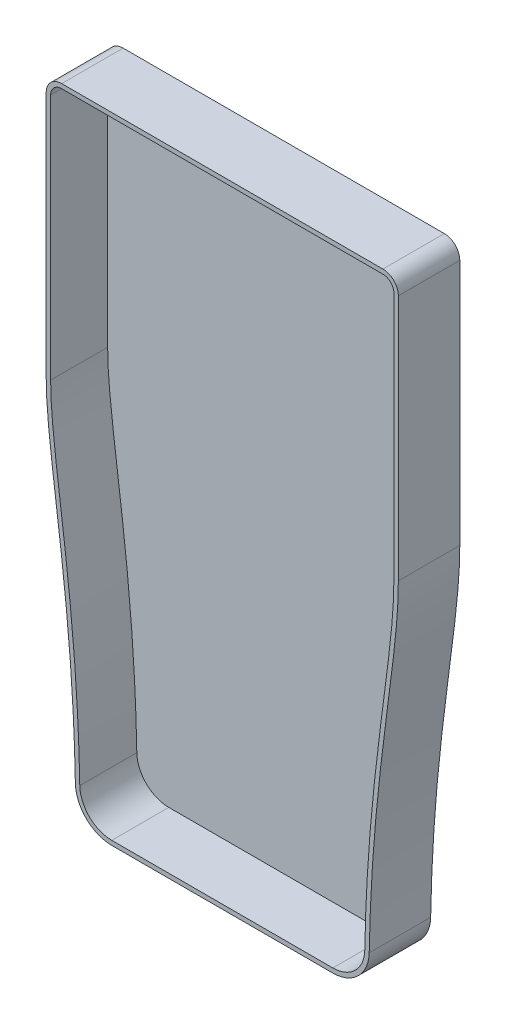
ISO-10303-21;
HEADER;
FILE_DESCRIPTION(('STEP AP214'),'2;1');
FILE_NAME('part.step','',(''),(''),'','','');
FILE_SCHEMA(('AUTOMOTIVE_DESIGN { 1 0 10303 214 1 1 1 1 }'));
ENDSEC;
DATA;
#1=APPLICATION_CONTEXT('core data for automotive mechanical design processes');
#2=APPLICATION_PROTOCOL_DEFINITION('international standard','automotive_design',2000,#1);
#3=PRODUCT_CONTEXT('',#1,'mechanical');
#4=PRODUCT('Part','Part','',(#3));
#5=PRODUCT_RELATED_PRODUCT_CATEGORY('part','',(#4));
#6=PRODUCT_DEFINITION_FORMATION('','',#4);
#7=PRODUCT_DEFINITION_CONTEXT('part definition',#1,'design');
#8=PRODUCT_DEFINITION('design','',#6,#7);
#9=PRODUCT_DEFINITION_SHAPE('','',#8);
#10=(LENGTH_UNIT() NAMED_UNIT(*) SI_UNIT(.MILLI.,.METRE.));
#11=(NAMED_UNIT(*) PLANE_ANGLE_UNIT() SI_UNIT($,.RADIAN.));
#12=(NAMED_UNIT(*) SI_UNIT($,.STERADIAN.) SOLID_ANGLE_UNIT());
#13=UNCERTAINTY_MEASURE_WITH_UNIT(LENGTH_MEASURE(1.E-05),#10,'distance_accuracy_value','');
#14=(GEOMETRIC_REPRESENTATION_CONTEXT(3) GLOBAL_UNCERTAINTY_ASSIGNED_CONTEXT((#13)) GLOBAL_UNIT_ASSIGNED_CONTEXT((#10,
#11,#12)) REPRESENTATION_CONTEXT('',''));
#15=CARTESIAN_POINT('',(0.,0.,0.));
#16=DIRECTION('',(0.,0.,1.));
#17=DIRECTION('',(1.,0.,0.));
#18=AXIS2_PLACEMENT_3D('',#15,#16,#17);
#19=CARTESIAN_POINT('',(105.710048323097,-5.29325956231415,15.5));
#20=DIRECTION('',(0.,0.,-1.));
#21=DIRECTION('',(-1.,0.,0.));
#22=AXIS2_PLACEMENT_3D('',#19,#20,#21);
#23=PLANE('',#22);
#24=DIRECTION('',(0.,1.,0.));
#25=VECTOR('',#24,1.);
#26=CARTESIAN_POINT('',(196.210048323097,-5.29325956231415,15.5));
#27=LINE('',#26,#25);
#28=CARTESIAN_POINT('',(196.210048323097,33.070955585428,15.5));
#29=VERTEX_POINT('',#28);
#30=CARTESIAN_POINT('',(196.210048323097,100.170955585428,15.5));
#31=VERTEX_POINT('',#30);
#32=EDGE_CURVE('E178',#29,#31,#27,.T.);
#33=ORIENTED_EDGE('',*,*,#32,.T.);
#34=CARTESIAN_POINT('',(192.010048323097,100.170955585428,15.5));
#35=DIRECTION('',(0.,0.,-1.));
#36=DIRECTION('',(-1.,0.,0.));
#37=AXIS2_PLACEMENT_3D('',#34,#35,#36);
#38=CIRCLE('',#37,4.2);
#39=CARTESIAN_POINT('',(192.010048323097,104.370955585428,15.5));
#40=VERTEX_POINT('',#39);
#41=EDGE_CURVE('E42',#31,#40,#38,.F.);
#42=ORIENTED_EDGE('',*,*,#41,.T.);
#43=DIRECTION('',(1.,0.,0.));
#44=VECTOR('',#43,1.);
#45=CARTESIAN_POINT('',(105.710048323097,104.370955585428,15.5));
#46=LINE('',#45,#44);
#47=CARTESIAN_POINT('',(104.710048323097,104.370955585428,15.5));
#48=VERTEX_POINT('',#47);
#49=EDGE_CURVE('E273',#48,#40,#46,.T.);
#50=ORIENTED_EDGE('',*,*,#49,.F.);
#51=CARTESIAN_POINT('',(104.710048323097,100.170955585428,15.5));
#52=DIRECTION('',(0.,0.,-1.));
#53=DIRECTION('',(-1.,0.,0.));
#54=AXIS2_PLACEMENT_3D('',#51,#52,#53);
#55=CIRCLE('',#54,4.2);
#56=CARTESIAN_POINT('',(100.510048323097,100.170955585428,15.5));
#57=VERTEX_POINT('',#56);
#58=EDGE_CURVE('E59',#48,#57,#55,.F.);
#59=ORIENTED_EDGE('',*,*,#58,.T.);
#60=DIRECTION('',(0.,1.,0.));
#61=VECTOR('',#60,1.);
#62=CARTESIAN_POINT('',(100.510048323097,-5.29325956231415,15.5));
#63=LINE('',#62,#61);
#64=CARTESIAN_POINT('',(100.510048323097,33.070955585428,15.5));
#65=VERTEX_POINT('',#64);
#66=EDGE_CURVE('E37',#65,#57,#63,.T.);
#67=ORIENTED_EDGE('',*,*,#66,.F.);
#68=CARTESIAN_POINT('',(100.510048323097,33.070955585428,15.5));
#69=CARTESIAN_POINT('',(100.510092475013,32.5448592155933,15.5));
#70=CARTESIAN_POINT('',(100.516093079888,32.0187979256957,15.5));
#71=CARTESIAN_POINT('',(100.538455257829,30.9669509341396,15.5));
#72=CARTESIAN_POINT('',(100.554815641601,30.44116520778,15.5));
#73=CARTESIAN_POINT('',(100.596306124888,29.390967340092,15.5));
#74=CARTESIAN_POINT('',(100.621419254969,28.866554504979,15.5));
#75=CARTESIAN_POINT('',(100.67915519967,27.8181298224943,15.5));
#76=CARTESIAN_POINT('',(100.71177825742,27.294117988656,15.5));
#77=CARTESIAN_POINT('',(100.783395457989,26.2469569307146,15.5));
#78=CARTESIAN_POINT('',(100.82238446421,25.7238073518247,15.5));
#79=CARTESIAN_POINT('',(100.905807071692,24.6779403044083,15.5));
#80=CARTESIAN_POINT('',(100.950240732255,24.1552228406507,15.5));
#81=CARTESIAN_POINT('',(101.090416872595,22.5879527694468,15.5));
#82=CARTESIAN_POINT('',(101.193053544,21.544017120129,15.5));
#83=CARTESIAN_POINT('',(101.411317437155,19.4575514940399,15.5));
#84=CARTESIAN_POINT('',(101.526944437813,18.4150214936502,15.5));
#85=CARTESIAN_POINT('',(101.76711811548,16.3309445867579,15.5));
#86=CARTESIAN_POINT('',(101.891665235795,15.2893977317248,15.5));
#87=CARTESIAN_POINT('',(102.146446323574,13.2073612546778,15.5));
#88=CARTESIAN_POINT('',(102.276678364129,12.1668713948923,15.5));
#89=CARTESIAN_POINT('',(102.540389551225,10.0861500534575,15.5));
#90=CARTESIAN_POINT('',(102.673869171959,9.04591863221811,15.5));
#91=CARTESIAN_POINT('',(102.942084995039,6.9654912386623,15.5));
#92=CARTESIAN_POINT('',(103.076821346721,5.92529528568802,15.5));
#93=CARTESIAN_POINT('',(103.345950913694,3.8447666018199,15.5));
#94=CARTESIAN_POINT('',(103.480344098038,2.80443386690846,15.5));
#95=CARTESIAN_POINT('',(103.747491126608,0.723498632243151,15.5));
#96=CARTESIAN_POINT('',(103.880244879601,-0.317103879262746,15.5));
#97=CARTESIAN_POINT('',(104.143060287182,-2.39867976895285,15.5));
#98=CARTESIAN_POINT('',(104.273121864063,-3.4396531569623,15.5));
#99=CARTESIAN_POINT('',(104.585164281567,-5.97238958547761,15.5));
#100=CARTESIAN_POINT('',(104.765269527346,-7.4643848745359,15.5));
#101=CARTESIAN_POINT('',(105.116159198595,-10.4494810061276,15.5));
#102=CARTESIAN_POINT('',(105.286943584284,-11.9425818533521,15.5));
#103=CARTESIAN_POINT('',(105.617683110478,-14.9299385292267,15.5));
#104=CARTESIAN_POINT('',(105.777638588776,-16.424194320378,15.5));
#105=CARTESIAN_POINT('',(106.085575891817,-19.4138730990942,15.5));
#106=CARTESIAN_POINT('',(106.233558260958,-20.9092960304658,15.5));
#107=CARTESIAN_POINT('',(106.516690068569,-23.9012924587158,15.5));
#108=CARTESIAN_POINT('',(106.651840067279,-25.3978659024862,15.5));
#109=CARTESIAN_POINT('',(106.908667454794,-28.3921245091167,15.5));
#110=CARTESIAN_POINT('',(107.030345249949,-29.8898096370737,15.5));
#111=CARTESIAN_POINT('',(107.259786369211,-32.8865676542502,15.5));
#112=CARTESIAN_POINT('',(107.367546721968,-34.3856407712243,15.5));
#113=CARTESIAN_POINT('',(107.568789014741,-37.384759538514,15.5));
#114=CARTESIAN_POINT('',(107.662270825892,-38.8848051974842,15.5));
#115=CARTESIAN_POINT('',(107.834733991233,-41.8858038484005,15.5));
#116=CARTESIAN_POINT('',(107.913714637531,-43.3867568810545,15.5));
#117=CARTESIAN_POINT('',(108.057040644938,-46.3895011105803,15.5));
#118=CARTESIAN_POINT('',(108.121384650688,-47.8912923721748,15.5));
#119=CARTESIAN_POINT('',(108.235368239021,-50.8956407787872,15.5));
#120=CARTESIAN_POINT('',(108.285005787553,-52.3981980009832,15.5));
#121=CARTESIAN_POINT('',(108.369575554945,-55.4040033259311,15.5));
#122=CARTESIAN_POINT('',(108.404505062455,-56.9072515049707,15.5));
#123=CARTESIAN_POINT('',(108.432076923763,-58.4106345036521,15.5));
#124=B_SPLINE_CURVE_WITH_KNOTS('',3,(#68,#69,#70,#71,#72,#73,#74,#75,#76,#77,#78,#79,#80,#81,
#82,#83,#84,#85,#86,#87,#88,#89,#90,#91,#92,#93,#94,#95,#96,#97,#98,#99,#100,#101,#102,#103,
#104,#105,#106,#107,#108,#109,#110,#111,#112,#113,#114,#115,#116,#117,#118,#119,#120,#121,#122,
#123),.UNSPECIFIED.,.F.,.F.,(4,2,2,2,2,2,2,2,2,2,2,2,2,2,2,2,2,2,2,2,2,2,2,2,2,2,2,4),(0.,
1.57820535793768,3.15622957223803,4.73121124721474,6.30624391850679,7.88001194138252,
9.45379710672228,12.6005694344072,15.7472882124754,18.8941634822641,22.039980274162,
25.1862591900905,28.3329168598722,31.4798489158888,34.6269553120024,37.7741524197394,
42.2826081434555,46.7910831077563,51.299417371638,55.8075465330431,60.3154787858644,
64.8232750329704,69.3320321017489,73.8408298596606,78.3498476610003,82.8592828288918,
87.3693414065303,91.8802310267606),.UNSPECIFIED.);
#125=CARTESIAN_POINT('',(108.432076923763,-58.4106345036521,15.5));
#126=VERTEX_POINT('',#125);
#127=EDGE_CURVE('E161',#65,#126,#124,.T.);
#128=ORIENTED_EDGE('',*,*,#127,.T.);
#129=CARTESIAN_POINT('',(118.330411381617,-58.229044414572,15.5));
#130=DIRECTION('',(0.,0.,-1.));
#131=DIRECTION('',(-1.,0.,0.));
#132=AXIS2_PLACEMENT_3D('',#129,#130,#131);
#133=CIRCLE('',#132,9.9);
#134=CARTESIAN_POINT('',(118.330411381617,-68.129044414572,15.5));
#135=VERTEX_POINT('',#134);
#136=EDGE_CURVE('E151',#126,#135,#133,.F.);
#137=ORIENTED_EDGE('',*,*,#136,.T.);
#138=DIRECTION('',(1.,0.,0.));
#139=VECTOR('',#138,1.);
#140=CARTESIAN_POINT('',(105.710048323097,-68.129044414572,15.5));
#141=LINE('',#140,#139);
#142=CARTESIAN_POINT('',(178.390174509068,-68.129044414572,15.5));
#143=VERTEX_POINT('',#142);
#144=EDGE_CURVE('E145',#135,#143,#141,.T.);
#145=ORIENTED_EDGE('',*,*,#144,.T.);
#146=CARTESIAN_POINT('',(178.390174509068,-58.229044414572,15.5));
#147=DIRECTION('',(0.,0.,-1.));
#148=DIRECTION('',(-1.,0.,0.));
#149=AXIS2_PLACEMENT_3D('',#146,#147,#148);
#150=CIRCLE('',#149,9.9);
#151=CARTESIAN_POINT('',(188.288478251496,-58.4123011269709,15.5));
#152=VERTEX_POINT('',#151);
#153=EDGE_CURVE('E157',#143,#152,#150,.F.);
#154=ORIENTED_EDGE('',*,*,#153,.T.);
#155=CARTESIAN_POINT('',(196.210048323097,33.070955585428,15.5));
#156=CARTESIAN_POINT('',(196.210044601962,32.5450114454601,15.5));
#157=CARTESIAN_POINT('',(196.205427533294,32.0190862065223,15.5));
#158=CARTESIAN_POINT('',(196.187764122159,30.9674049996183,15.5));
#159=CARTESIAN_POINT('',(196.174718257611,30.4416490237458,15.5));
#160=CARTESIAN_POINT('',(196.124195294103,28.8666966601418,15.5));
#161=CARTESIAN_POINT('',(196.075326832993,27.8178601004715,15.5));
#162=CARTESIAN_POINT('',(195.953049504858,25.7226550755122,15.5));
#163=CARTESIAN_POINT('',(195.879663393666,24.676285224344,15.5));
#164=CARTESIAN_POINT('',(195.713488574007,22.5855085646436,15.5));
#165=CARTESIAN_POINT('',(195.620707191823,21.5411011646993,15.5));
#166=CARTESIAN_POINT('',(195.420173601825,19.4538328823376,15.5));
#167=CARTESIAN_POINT('',(195.312422632319,18.4109718792042,15.5));
#168=CARTESIAN_POINT('',(195.085740595884,16.3264226443745,15.5));
#169=CARTESIAN_POINT('',(194.966808944175,15.2847344769074,15.5));
#170=CARTESIAN_POINT('',(194.721025266089,13.2025106754047,15.5));
#171=CARTESIAN_POINT('',(194.594174819306,12.1619748533846,15.5));
#172=CARTESIAN_POINT('',(194.335233976522,10.0813607503142,15.5));
#173=CARTESIAN_POINT('',(194.203142598998,9.04128259220496,15.5));
#174=CARTESIAN_POINT('',(193.93601384872,6.96133148218757,15.5));
#175=CARTESIAN_POINT('',(193.800975991508,5.92145859282657,15.5));
#176=CARTESIAN_POINT('',(193.529881779639,3.84171389189881,15.5));
#177=CARTESIAN_POINT('',(193.393825299709,2.80184209673402,15.5));
#178=CARTESIAN_POINT('',(193.12230921514,0.721936146751257,15.5));
#179=CARTESIAN_POINT('',(192.986849658797,-0.318098014402128,15.5));
#180=CARTESIAN_POINT('',(192.717872010067,-2.39845640709024,15.5));
#181=CARTESIAN_POINT('',(192.584353988699,-3.43878064782441,15.5));
#182=CARTESIAN_POINT('',(192.263191910814,-5.97077408594009,15.5));
#183=CARTESIAN_POINT('',(192.077168552196,-7.46265003549103,15.5));
#184=CARTESIAN_POINT('',(191.714070482375,-10.4474569193826,15.5));
#185=CARTESIAN_POINT('',(191.53699554581,-11.9403878261935,15.5));
#186=CARTESIAN_POINT('',(191.193768963579,-14.9274112990819,15.5));
#187=CARTESIAN_POINT('',(191.027616613447,-16.4215037839407,15.5));
#188=CARTESIAN_POINT('',(190.707709976981,-19.4109040767988,15.5));
#189=CARTESIAN_POINT('',(190.55395474905,-20.9062117837683,15.5));
#190=CARTESIAN_POINT('',(190.259916487299,-23.8980539191113,15.5));
#191=CARTESIAN_POINT('',(190.119632561742,-25.3945882596644,15.5));
#192=CARTESIAN_POINT('',(189.853297885993,-28.38886218929,15.5));
#193=CARTESIAN_POINT('',(189.727246544158,-29.8866017256544,15.5));
#194=CARTESIAN_POINT('',(189.489882050559,-32.88335677958,15.5));
#195=CARTESIAN_POINT('',(189.378569948084,-34.3823723803474,15.5));
#196=CARTESIAN_POINT('',(189.171016961776,-37.3814857232787,15.5));
#197=CARTESIAN_POINT('',(189.07477646167,-38.8815834920184,15.5));
#198=CARTESIAN_POINT('',(188.897533480741,-41.8828122786857,15.5));
#199=CARTESIAN_POINT('',(188.816532346914,-43.3839433761897,15.5));
#200=CARTESIAN_POINT('',(188.669815829449,-46.387184492949,15.5));
#201=CARTESIAN_POINT('',(188.604102805305,-47.8892946274777,15.5));
#202=CARTESIAN_POINT('',(188.487922857202,-50.8944350207332,15.5));
#203=CARTESIAN_POINT('',(188.437459292811,-52.3974654092233,15.5));
#204=CARTESIAN_POINT('',(188.351652415294,-55.404385059127,15.5));
#205=CARTESIAN_POINT('',(188.316313399281,-56.9082744432318,15.5));
#206=CARTESIAN_POINT('',(188.288478251496,-58.4123011269709,15.5));
#207=B_SPLINE_CURVE_WITH_KNOTS('',3,(#155,#156,#157,#158,#159,#160,#161,#162,#163,#164,#165,
#166,#167,#168,#169,#170,#171,#172,#173,#174,#175,#176,#177,#178,#179,#180,#181,#182,#183,#184,
#185,#186,#187,#188,#189,#190,#191,#192,#193,#194,#195,#196,#197,#198,#199,#200,#201,#202,#203,
#204,#205,#206),.UNSPECIFIED.,.F.,.F.,(4,2,2,2,2,2,2,2,2,2,2,2,2,2,2,2,2,2,2,2,2,2,2,2,2,4),(0.,
1.57778224181177,3.15547502994499,6.3049958467599,9.45160154828052,12.5970208061097,
15.7421800250323,18.8875038359709,22.0322022286827,25.1774923677249,28.3233036103816,
31.4695083111716,34.6159630598348,37.7625326167015,42.2727993310521,46.7829523994907,
51.2928142938562,55.8023333280168,60.311553647383,64.8205864513097,69.3299400817887,
73.8394085026057,78.3492753246626,82.8598377173483,87.37139309686,91.884229427883),.UNSPECIFIED.);
#208=EDGE_CURVE('E160',#29,#152,#207,.T.);
#209=ORIENTED_EDGE('',*,*,#208,.F.);
#210=EDGE_LOOP('',(#33,#42,#50,#59,#67,#128,#137,#145,#154,#209));
#211=FACE_BOUND('',#210,.T.);
#212=DIRECTION('',(0.,1.,0.));
#213=VECTOR('',#212,1.);
#214=CARTESIAN_POINT('',(195.010048323097,33.070955585428,15.5));
#215=LINE('',#214,#213);
#216=CARTESIAN_POINT('',(195.010048323097,33.070955585428,15.5));
#217=VERTEX_POINT('',#216);
#218=CARTESIAN_POINT('',(195.010048323097,100.170955585428,15.5));
#219=VERTEX_POINT('',#218);
#220=EDGE_CURVE('E211',#217,#219,#215,.T.);
#221=ORIENTED_EDGE('',*,*,#220,.F.);
#222=CARTESIAN_POINT('',(195.010048323097,33.070955585428,15.5));
#223=CARTESIAN_POINT('',(195.010048323097,11.3350971217336,15.5));
#224=CARTESIAN_POINT('',(187.010048323097,-16.929044414572,15.5));
#225=CARTESIAN_POINT('',(187.010048323097,-66.929044414572,15.5));
#226=B_SPLINE_CURVE_WITH_KNOTS('',3,(#222,#223,#224,#225),.UNSPECIFIED.,.F.,.F.,(4,4),(0.,1.),.UNSPECIFIED.);
#227=CARTESIAN_POINT('',(187.088683858466,-58.3900881925704,15.5));
#228=VERTEX_POINT('',#227);
#229=EDGE_CURVE('E205',#217,#228,#226,.T.);
#230=ORIENTED_EDGE('',*,*,#229,.T.);
#231=CARTESIAN_POINT('',(178.390174509068,-58.229044414572,15.5));
#232=DIRECTION('',(0.,0.,-1.));
#233=DIRECTION('',(-1.,0.,0.));
#234=AXIS2_PLACEMENT_3D('',#231,#232,#233);
#235=CIRCLE('',#234,8.7);
#236=CARTESIAN_POINT('',(178.390174509068,-66.929044414572,15.5));
#237=VERTEX_POINT('',#236);
#238=EDGE_CURVE('E548',#237,#228,#235,.F.);
#239=ORIENTED_EDGE('',*,*,#238,.F.);
#240=DIRECTION('',(1.,0.,0.));
#241=VECTOR('',#240,1.);
#242=CARTESIAN_POINT('',(109.710048323097,-66.929044414572,15.5));
#243=LINE('',#242,#241);
#244=CARTESIAN_POINT('',(118.330411381617,-66.929044414572,15.5));
#245=VERTEX_POINT('',#244);
#246=EDGE_CURVE('E212',#245,#237,#243,.T.);
#247=ORIENTED_EDGE('',*,*,#246,.F.);
#248=CARTESIAN_POINT('',(118.330411381617,-58.229044414572,15.5));
#249=DIRECTION('',(0.,0.,-1.));
#250=DIRECTION('',(-1.,0.,0.));
#251=AXIS2_PLACEMENT_3D('',#248,#249,#250);
#252=CIRCLE('',#251,8.7);
#253=CARTESIAN_POINT('',(109.63187503987,-58.3886235839805,15.5));
#254=VERTEX_POINT('',#253);
#255=EDGE_CURVE('E545',#254,#245,#252,.F.);
#256=ORIENTED_EDGE('',*,*,#255,.F.);
#257=CARTESIAN_POINT('',(101.710048323097,33.070955585428,15.5));
#258=CARTESIAN_POINT('',(101.710048323097,14.099715191449,15.5));
#259=CARTESIAN_POINT('',(109.710048323097,-16.929044414572,15.5));
#260=CARTESIAN_POINT('',(109.710048323097,-66.929044414572,15.5));
#261=B_SPLINE_CURVE_WITH_KNOTS('',3,(#257,#258,#259,#260),.UNSPECIFIED.,.F.,.F.,(4,4),(0.,1.),.UNSPECIFIED.);
#262=CARTESIAN_POINT('',(101.710048323097,33.070955585428,15.5));
#263=VERTEX_POINT('',#262);
#264=EDGE_CURVE('E213',#263,#254,#261,.T.);
#265=ORIENTED_EDGE('',*,*,#264,.F.);
#266=DIRECTION('',(0.,1.,0.));
#267=VECTOR('',#266,1.);
#268=CARTESIAN_POINT('',(101.710048323097,33.070955585428,15.5));
#269=LINE('',#268,#267);
#270=CARTESIAN_POINT('',(101.710048323097,100.170955585428,15.5));
#271=VERTEX_POINT('',#270);
#272=EDGE_CURVE('E490',#263,#271,#269,.T.);
#273=ORIENTED_EDGE('',*,*,#272,.T.);
#274=CARTESIAN_POINT('',(104.710048323097,100.170955585428,15.5));
#275=DIRECTION('',(0.,0.,-1.));
#276=DIRECTION('',(-1.,0.,0.));
#277=AXIS2_PLACEMENT_3D('',#274,#275,#276);
#278=CIRCLE('',#277,3.);
#279=CARTESIAN_POINT('',(104.710048323097,103.170955585428,15.5));
#280=VERTEX_POINT('',#279);
#281=EDGE_CURVE('E471',#280,#271,#278,.F.);
#282=ORIENTED_EDGE('',*,*,#281,.F.);
#283=DIRECTION('',(1.,0.,0.));
#284=VECTOR('',#283,1.);
#285=CARTESIAN_POINT('',(101.710048323097,103.170955585428,15.5));
#286=LINE('',#285,#284);
#287=CARTESIAN_POINT('',(192.010048323097,103.170955585428,15.5));
#288=VERTEX_POINT('',#287);
#289=EDGE_CURVE('E498',#280,#288,#286,.T.);
#290=ORIENTED_EDGE('',*,*,#289,.T.);
#291=CARTESIAN_POINT('',(192.010048323097,100.170955585428,15.5));
#292=DIRECTION('',(0.,0.,-1.));
#293=DIRECTION('',(-1.,0.,0.));
#294=AXIS2_PLACEMENT_3D('',#291,#292,#293);
#295=CIRCLE('',#294,3.);
#296=EDGE_CURVE('E484',#219,#288,#295,.F.);
#297=ORIENTED_EDGE('',*,*,#296,.F.);
#298=EDGE_LOOP('',(#221,#230,#239,#247,#256,#265,#273,#282,#290,#297));
#299=FACE_BOUND('',#298,.T.);
#300=ADVANCED_FACE('F33',(#211,#299),#23,.F.);
#301=CARTESIAN_POINT('',(101.710048323097,33.070955585428,15.5));
#302=CARTESIAN_POINT('',(101.710048323097,14.099715191449,15.5));
#303=CARTESIAN_POINT('',(109.710048323097,-16.929044414572,15.5));
#304=CARTESIAN_POINT('',(109.710048323097,-66.929044414572,15.5));
#305=B_SPLINE_CURVE_WITH_KNOTS('',3,(#301,#302,#303,#304),.UNSPECIFIED.,.F.,.F.,(4,4),(0.,1.),.UNSPECIFIED.);
#306=DIRECTION('',(0.,0.,-1.));
#307=VECTOR('',#306,1.);
#308=SURFACE_OF_LINEAR_EXTRUSION('',#305,#307);
#309=OFFSET_SURFACE('',#308,-1.2,.F.);
#310=CARTESIAN_POINT('',(100.510048323097,33.070955585428,-1.2));
#311=CARTESIAN_POINT('',(100.510092475013,32.5448592155933,-1.2));
#312=CARTESIAN_POINT('',(100.516093079888,32.0187979256957,-1.2));
#313=CARTESIAN_POINT('',(100.538455257829,30.9669509341396,-1.2));
#314=CARTESIAN_POINT('',(100.554815641601,30.44116520778,-1.2));
#315=CARTESIAN_POINT('',(100.596306124888,29.390967340092,-1.2));
#316=CARTESIAN_POINT('',(100.621419254969,28.866554504979,-1.2));
#317=CARTESIAN_POINT('',(100.67915519967,27.8181298224943,-1.2));
#318=CARTESIAN_POINT('',(100.71177825742,27.294117988656,-1.2));
#319=CARTESIAN_POINT('',(100.783395457989,26.2469569307146,-1.2));
#320=CARTESIAN_POINT('',(100.82238446421,25.7238073518247,-1.2));
#321=CARTESIAN_POINT('',(100.905807071692,24.6779403044083,-1.2));
#322=CARTESIAN_POINT('',(100.950240732255,24.1552228406507,-1.2));
#323=CARTESIAN_POINT('',(101.090416872595,22.5879527694468,-1.2));
#324=CARTESIAN_POINT('',(101.193053544,21.544017120129,-1.2));
#325=CARTESIAN_POINT('',(101.411317437155,19.4575514940399,-1.2));
#326=CARTESIAN_POINT('',(101.526944437813,18.4150214936502,-1.2));
#327=CARTESIAN_POINT('',(101.76711811548,16.3309445867579,-1.2));
#328=CARTESIAN_POINT('',(101.891665235795,15.2893977317248,-1.2));
#329=CARTESIAN_POINT('',(102.146446323574,13.2073612546778,-1.2));
#330=CARTESIAN_POINT('',(102.276678364129,12.1668713948923,-1.2));
#331=CARTESIAN_POINT('',(102.540389551225,10.0861500534575,-1.2));
#332=CARTESIAN_POINT('',(102.673869171959,9.04591863221811,-1.2));
#333=CARTESIAN_POINT('',(102.942084995039,6.9654912386623,-1.2));
#334=CARTESIAN_POINT('',(103.076821346721,5.92529528568802,-1.2));
#335=CARTESIAN_POINT('',(103.345950913694,3.8447666018199,-1.2));
#336=CARTESIAN_POINT('',(103.480344098038,2.80443386690846,-1.2));
#337=CARTESIAN_POINT('',(103.747491126608,0.723498632243151,-1.2));
#338=CARTESIAN_POINT('',(103.880244879601,-0.317103879262746,-1.2));
#339=CARTESIAN_POINT('',(104.143060287182,-2.39867976895285,-1.2));
#340=CARTESIAN_POINT('',(104.273121864063,-3.4396531569623,-1.2));
#341=CARTESIAN_POINT('',(104.585164281567,-5.97238958547761,-1.2));
#342=CARTESIAN_POINT('',(104.765269527346,-7.4643848745359,-1.2));
#343=CARTESIAN_POINT('',(105.116159198595,-10.4494810061276,-1.2));
#344=CARTESIAN_POINT('',(105.286943584284,-11.9425818533521,-1.2));
#345=CARTESIAN_POINT('',(105.617683110478,-14.9299385292267,-1.2));
#346=CARTESIAN_POINT('',(105.777638588776,-16.424194320378,-1.2));
#347=CARTESIAN_POINT('',(106.085575891817,-19.4138730990942,-1.2));
#348=CARTESIAN_POINT('',(106.233558260958,-20.9092960304658,-1.2));
#349=CARTESIAN_POINT('',(106.516690068569,-23.9012924587158,-1.2));
#350=CARTESIAN_POINT('',(106.651840067279,-25.3978659024862,-1.2));
#351=CARTESIAN_POINT('',(106.908667454794,-28.3921245091167,-1.2));
#352=CARTESIAN_POINT('',(107.030345249949,-29.8898096370737,-1.2));
#353=CARTESIAN_POINT('',(107.259786369211,-32.8865676542502,-1.2));
#354=CARTESIAN_POINT('',(107.367546721968,-34.3856407712243,-1.2));
#355=CARTESIAN_POINT('',(107.568789014741,-37.384759538514,-1.2));
#356=CARTESIAN_POINT('',(107.662270825892,-38.8848051974842,-1.2));
#357=CARTESIAN_POINT('',(107.834733991233,-41.8858038484005,-1.2));
#358=CARTESIAN_POINT('',(107.913714637531,-43.3867568810545,-1.2));
#359=CARTESIAN_POINT('',(108.057040644938,-46.3895011105803,-1.2));
#360=CARTESIAN_POINT('',(108.121384650688,-47.8912923721748,-1.2));
#361=CARTESIAN_POINT('',(108.235368239021,-50.8956407787872,-1.2));
#362=CARTESIAN_POINT('',(108.285005787553,-52.3981980009832,-1.2));
#363=CARTESIAN_POINT('',(108.369575554945,-55.4040033259311,-1.2));
#364=CARTESIAN_POINT('',(108.404505062455,-56.9072515049707,-1.2));
#365=CARTESIAN_POINT('',(108.432076923763,-58.4106345036521,-1.2));
#366=B_SPLINE_CURVE_WITH_KNOTS('',3,(#310,#311,#312,#313,#314,#315,#316,#317,#318,#319,#320,
#321,#322,#323,#324,#325,#326,#327,#328,#329,#330,#331,#332,#333,#334,#335,#336,#337,#338,#339,
#340,#341,#342,#343,#344,#345,#346,#347,#348,#349,#350,#351,#352,#353,#354,#355,#356,#357,#358,
#359,#360,#361,#362,#363,#364,#365),.UNSPECIFIED.,.F.,.F.,(4,2,2,2,2,2,2,2,2,2,2,2,2,2,2,2,2,2,
2,2,2,2,2,2,2,2,2,4),(0.,1.57820535793768,3.15622957223803,4.73121124721474,6.30624391850679,
7.88001194138252,9.45379710672228,12.6005694344072,15.7472882124754,18.8941634822641,
22.039980274162,25.1862591900905,28.3329168598722,31.4798489158888,34.6269553120024,
37.7741524197394,42.2826081434555,46.7910831077563,51.299417371638,55.8075465330431,
60.3154787858644,64.8232750329704,69.3320321017489,73.8408298596606,78.3498476610003,
82.8592828288918,87.3693414065303,91.8802310267606),.UNSPECIFIED.);
#367=CARTESIAN_POINT('',(100.510048323097,33.070955585428,-1.2));
#368=VERTEX_POINT('',#367);
#369=CARTESIAN_POINT('',(108.432076923763,-58.4106345036521,-1.2));
#370=VERTEX_POINT('',#369);
#371=EDGE_CURVE('E218',#368,#370,#366,.T.);
#372=ORIENTED_EDGE('',*,*,#371,.T.);
#373=DIRECTION('',(0.,0.,-1.));
#374=VECTOR('',#373,1.);
#375=CARTESIAN_POINT('',(108.432076923763,-58.4106345036521,15.5));
#376=LINE('',#375,#374);
#377=EDGE_CURVE('E167',#370,#126,#376,.F.);
#378=ORIENTED_EDGE('',*,*,#377,.T.);
#379=ORIENTED_EDGE('',*,*,#127,.F.);
#380=DIRECTION('',(0.,0.,-1.));
#381=VECTOR('',#380,1.);
#382=CARTESIAN_POINT('',(100.510048323097,33.070955585428,15.5));
#383=LINE('',#382,#381);
#384=EDGE_CURVE('E74',#65,#368,#383,.T.);
#385=ORIENTED_EDGE('',*,*,#384,.T.);
#386=EDGE_LOOP('',(#372,#378,#379,#385));
#387=FACE_BOUND('',#386,.T.);
#388=ADVANCED_FACE('F189',(#387),#309,.F.);
#389=CARTESIAN_POINT('',(109.710048323097,-68.129044414572,15.5));
#390=DIRECTION('',(0.,1.,0.));
#391=DIRECTION('',(0.,0.,1.));
#392=AXIS2_PLACEMENT_3D('',#389,#390,#391);
#393=PLANE('',#392);
#394=DIRECTION('',(1.,0.,0.));
#395=VECTOR('',#394,1.);
#396=CARTESIAN_POINT('',(105.710048323097,-68.129044414572,-1.2));
#397=LINE('',#396,#395);
#398=CARTESIAN_POINT('',(118.330411381617,-68.129044414572,-1.2));
#399=VERTEX_POINT('',#398);
#400=CARTESIAN_POINT('',(178.390174509068,-68.129044414572,-1.2));
#401=VERTEX_POINT('',#400);
#402=EDGE_CURVE('E148',#399,#401,#397,.T.);
#403=ORIENTED_EDGE('',*,*,#402,.T.);
#404=DIRECTION('',(0.,0.,1.));
#405=VECTOR('',#404,1.);
#406=CARTESIAN_POINT('',(178.390174509068,-68.129044414572,15.5));
#407=LINE('',#406,#405);
#408=EDGE_CURVE('E141',#401,#143,#407,.T.);
#409=ORIENTED_EDGE('',*,*,#408,.T.);
#410=ORIENTED_EDGE('',*,*,#144,.F.);
#411=DIRECTION('',(0.,0.,1.));
#412=VECTOR('',#411,1.);
#413=CARTESIAN_POINT('',(118.330411381617,-68.129044414572,15.5));
#414=LINE('',#413,#412);
#415=EDGE_CURVE('E152',#135,#399,#414,.F.);
#416=ORIENTED_EDGE('',*,*,#415,.T.);
#417=EDGE_LOOP('',(#403,#409,#410,#416));
#418=FACE_BOUND('',#417,.T.);
#419=ADVANCED_FACE('F143',(#418),#393,.F.);
#420=CARTESIAN_POINT('',(195.010048323097,33.070955585428,15.5));
#421=CARTESIAN_POINT('',(195.010048323097,11.3350971217336,15.5));
#422=CARTESIAN_POINT('',(187.010048323097,-16.929044414572,15.5));
#423=CARTESIAN_POINT('',(187.010048323097,-66.929044414572,15.5));
#424=B_SPLINE_CURVE_WITH_KNOTS('',3,(#420,#421,#422,#423),.UNSPECIFIED.,.F.,.F.,(4,4),(0.,1.),.UNSPECIFIED.);
#425=DIRECTION('',(0.,0.,-1.));
#426=VECTOR('',#425,1.);
#427=SURFACE_OF_LINEAR_EXTRUSION('',#424,#426);
#428=OFFSET_SURFACE('',#427,1.2,.F.);
#429=ORIENTED_EDGE('',*,*,#208,.T.);
#430=DIRECTION('',(0.,0.,-1.));
#431=VECTOR('',#430,1.);
#432=CARTESIAN_POINT('',(188.288478251496,-58.4123011269709,15.5));
#433=LINE('',#432,#431);
#434=CARTESIAN_POINT('',(188.288478251496,-58.4123011269709,-1.2));
#435=VERTEX_POINT('',#434);
#436=EDGE_CURVE('E166',#152,#435,#433,.T.);
#437=ORIENTED_EDGE('',*,*,#436,.T.);
#438=CARTESIAN_POINT('',(196.210048323097,33.070955585428,-1.2));
#439=CARTESIAN_POINT('',(196.210044601962,32.5450114454601,-1.2));
#440=CARTESIAN_POINT('',(196.205427533294,32.0190862065223,-1.2));
#441=CARTESIAN_POINT('',(196.187764122159,30.9674049996183,-1.2));
#442=CARTESIAN_POINT('',(196.174718257611,30.4416490237458,-1.2));
#443=CARTESIAN_POINT('',(196.124195294103,28.8666966601418,-1.2));
#444=CARTESIAN_POINT('',(196.075326832993,27.8178601004715,-1.2));
#445=CARTESIAN_POINT('',(195.953049504858,25.7226550755122,-1.2));
#446=CARTESIAN_POINT('',(195.879663393666,24.676285224344,-1.2));
#447=CARTESIAN_POINT('',(195.713488574007,22.5855085646436,-1.2));
#448=CARTESIAN_POINT('',(195.620707191823,21.5411011646993,-1.2));
#449=CARTESIAN_POINT('',(195.420173601825,19.4538328823376,-1.2));
#450=CARTESIAN_POINT('',(195.312422632319,18.4109718792042,-1.2));
#451=CARTESIAN_POINT('',(195.085740595884,16.3264226443745,-1.2));
#452=CARTESIAN_POINT('',(194.966808944175,15.2847344769074,-1.2));
#453=CARTESIAN_POINT('',(194.721025266089,13.2025106754047,-1.2));
#454=CARTESIAN_POINT('',(194.594174819306,12.1619748533846,-1.2));
#455=CARTESIAN_POINT('',(194.335233976522,10.0813607503142,-1.2));
#456=CARTESIAN_POINT('',(194.203142598998,9.04128259220496,-1.2));
#457=CARTESIAN_POINT('',(193.93601384872,6.96133148218757,-1.2));
#458=CARTESIAN_POINT('',(193.800975991508,5.92145859282657,-1.2));
#459=CARTESIAN_POINT('',(193.529881779639,3.84171389189881,-1.2));
#460=CARTESIAN_POINT('',(193.393825299709,2.80184209673402,-1.2));
#461=CARTESIAN_POINT('',(193.12230921514,0.721936146751257,-1.2));
#462=CARTESIAN_POINT('',(192.986849658797,-0.318098014402128,-1.2));
#463=CARTESIAN_POINT('',(192.717872010067,-2.39845640709024,-1.2));
#464=CARTESIAN_POINT('',(192.584353988699,-3.43878064782441,-1.19999999999999));
#465=CARTESIAN_POINT('',(192.263191910814,-5.97077408594009,-1.19999999999999));
#466=CARTESIAN_POINT('',(192.077168552196,-7.46265003549103,-1.2));
#467=CARTESIAN_POINT('',(191.714070482375,-10.4474569193826,-1.2));
#468=CARTESIAN_POINT('',(191.53699554581,-11.9403878261935,-1.2));
#469=CARTESIAN_POINT('',(191.193768963579,-14.9274112990819,-1.2));
#470=CARTESIAN_POINT('',(191.027616613447,-16.4215037839407,-1.2));
#471=CARTESIAN_POINT('',(190.707709976981,-19.4109040767988,-1.2));
#472=CARTESIAN_POINT('',(190.55395474905,-20.9062117837683,-1.2));
#473=CARTESIAN_POINT('',(190.259916487299,-23.8980539191113,-1.2));
#474=CARTESIAN_POINT('',(190.119632561742,-25.3945882596644,-1.2));
#475=CARTESIAN_POINT('',(189.853297885993,-28.38886218929,-1.2));
#476=CARTESIAN_POINT('',(189.727246544158,-29.8866017256544,-1.2));
#477=CARTESIAN_POINT('',(189.489882050559,-32.88335677958,-1.2));
#478=CARTESIAN_POINT('',(189.378569948084,-34.3823723803474,-1.2));
#479=CARTESIAN_POINT('',(189.171016961776,-37.3814857232787,-1.2));
#480=CARTESIAN_POINT('',(189.07477646167,-38.8815834920184,-1.2));
#481=CARTESIAN_POINT('',(188.897533480741,-41.8828122786857,-1.2));
#482=CARTESIAN_POINT('',(188.816532346914,-43.3839433761897,-1.2));
#483=CARTESIAN_POINT('',(188.669815829449,-46.387184492949,-1.2));
#484=CARTESIAN_POINT('',(188.604102805305,-47.8892946274777,-1.2));
#485=CARTESIAN_POINT('',(188.487922857202,-50.8944350207332,-1.2));
#486=CARTESIAN_POINT('',(188.437459292811,-52.3974654092233,-1.2));
#487=CARTESIAN_POINT('',(188.351652415294,-55.404385059127,-1.2));
#488=CARTESIAN_POINT('',(188.316313399281,-56.9082744432318,-1.2));
#489=CARTESIAN_POINT('',(188.288478251496,-58.4123011269709,-1.2));
#490=B_SPLINE_CURVE_WITH_KNOTS('',3,(#438,#439,#440,#441,#442,#443,#444,#445,#446,#447,#448,
#449,#450,#451,#452,#453,#454,#455,#456,#457,#458,#459,#460,#461,#462,#463,#464,#465,#466,#467,
#468,#469,#470,#471,#472,#473,#474,#475,#476,#477,#478,#479,#480,#481,#482,#483,#484,#485,#486,
#487,#488,#489),.UNSPECIFIED.,.F.,.F.,(4,2,2,2,2,2,2,2,2,2,2,2,2,2,2,2,2,2,2,2,2,2,2,2,2,4),(0.,
1.57778224181177,3.15547502994499,6.3049958467599,9.45160154828052,12.5970208061097,
15.7421800250323,18.8875038359709,22.0322022286827,25.1774923677249,28.3233036103816,
31.4695083111716,34.6159630598348,37.7625326167015,42.2727993310521,46.7829523994907,
51.2928142938562,55.8023333280168,60.311553647383,64.8205864513097,69.3299400817887,
73.8394085026057,78.3492753246626,82.8598377173483,87.37139309686,91.884229427883),.UNSPECIFIED.);
#491=CARTESIAN_POINT('',(196.210048323097,33.070955585428,-1.2));
#492=VERTEX_POINT('',#491);
#493=EDGE_CURVE('E234',#492,#435,#490,.T.);
#494=ORIENTED_EDGE('',*,*,#493,.F.);
#495=DIRECTION('',(0.,0.,1.));
#496=VECTOR('',#495,1.);
#497=CARTESIAN_POINT('',(196.210048323097,33.070955585428,15.5));
#498=LINE('',#497,#496);
#499=EDGE_CURVE('E86',#29,#492,#498,.F.);
#500=ORIENTED_EDGE('',*,*,#499,.F.);
#501=EDGE_LOOP('',(#429,#437,#494,#500));
#502=FACE_BOUND('',#501,.T.);
#503=ADVANCED_FACE('F183',(#502),#428,.T.);
#504=CARTESIAN_POINT('',(196.210048323097,33.070955585428,15.5));
#505=DIRECTION('',(-1.,0.,0.));
#506=DIRECTION('',(0.,0.,1.));
#507=AXIS2_PLACEMENT_3D('',#504,#505,#506);
#508=PLANE('',#507);
#509=DIRECTION('',(0.,1.,0.));
#510=VECTOR('',#509,1.);
#511=CARTESIAN_POINT('',(196.210048323097,-5.29325956231415,-1.2));
#512=LINE('',#511,#510);
#513=CARTESIAN_POINT('',(196.210048323097,100.170955585428,-1.2));
#514=VERTEX_POINT('',#513);
#515=EDGE_CURVE('E241',#492,#514,#512,.T.);
#516=ORIENTED_EDGE('',*,*,#515,.T.);
#517=DIRECTION('',(0.,0.,1.));
#518=VECTOR('',#517,1.);
#519=CARTESIAN_POINT('',(196.210048323097,100.170955585428,15.5));
#520=LINE('',#519,#518);
#521=EDGE_CURVE('E254',#514,#31,#520,.T.);
#522=ORIENTED_EDGE('',*,*,#521,.T.);
#523=ORIENTED_EDGE('',*,*,#32,.F.);
#524=ORIENTED_EDGE('',*,*,#499,.T.);
#525=EDGE_LOOP('',(#516,#522,#523,#524));
#526=FACE_BOUND('',#525,.T.);
#527=ADVANCED_FACE('F188',(#526),#508,.F.);
#528=CARTESIAN_POINT('',(101.710048323097,104.370955585428,15.5));
#529=DIRECTION('',(0.,1.,0.));
#530=DIRECTION('',(0.,0.,1.));
#531=AXIS2_PLACEMENT_3D('',#528,#529,#530);
#532=PLANE('',#531);
#533=ORIENTED_EDGE('',*,*,#49,.T.);
#534=DIRECTION('',(0.,0.,1.));
#535=VECTOR('',#534,1.);
#536=CARTESIAN_POINT('',(192.010048323097,104.370955585428,15.5));
#537=LINE('',#536,#535);
#538=CARTESIAN_POINT('',(192.010048323097,104.370955585428,-1.2));
#539=VERTEX_POINT('',#538);
#540=EDGE_CURVE('E249',#40,#539,#537,.F.);
#541=ORIENTED_EDGE('',*,*,#540,.T.);
#542=DIRECTION('',(1.,0.,0.));
#543=VECTOR('',#542,1.);
#544=CARTESIAN_POINT('',(105.710048323097,104.370955585428,-1.2));
#545=LINE('',#544,#543);
#546=CARTESIAN_POINT('',(104.710048323097,104.370955585428,-1.2));
#547=VERTEX_POINT('',#546);
#548=EDGE_CURVE('E263',#547,#539,#545,.T.);
#549=ORIENTED_EDGE('',*,*,#548,.F.);
#550=DIRECTION('',(0.,0.,1.));
#551=VECTOR('',#550,1.);
#552=CARTESIAN_POINT('',(104.710048323097,104.370955585428,15.5));
#553=LINE('',#552,#551);
#554=EDGE_CURVE('E105',#547,#48,#553,.T.);
#555=ORIENTED_EDGE('',*,*,#554,.T.);
#556=EDGE_LOOP('',(#533,#541,#549,#555));
#557=FACE_BOUND('',#556,.T.);
#558=ADVANCED_FACE('F304',(#557),#532,.T.);
#559=CARTESIAN_POINT('',(100.510048323097,33.070955585428,15.5));
#560=DIRECTION('',(-1.,0.,0.));
#561=DIRECTION('',(0.,0.,1.));
#562=AXIS2_PLACEMENT_3D('',#559,#560,#561);
#563=PLANE('',#562);
#564=ORIENTED_EDGE('',*,*,#66,.T.);
#565=DIRECTION('',(0.,0.,1.));
#566=VECTOR('',#565,1.);
#567=CARTESIAN_POINT('',(100.510048323097,100.170955585428,15.5));
#568=LINE('',#567,#566);
#569=CARTESIAN_POINT('',(100.510048323097,100.170955585428,-1.2));
#570=VERTEX_POINT('',#569);
#571=EDGE_CURVE('E11',#57,#570,#568,.F.);
#572=ORIENTED_EDGE('',*,*,#571,.T.);
#573=DIRECTION('',(0.,1.,0.));
#574=VECTOR('',#573,1.);
#575=CARTESIAN_POINT('',(100.510048323097,-5.29325956231415,-1.2));
#576=LINE('',#575,#574);
#577=EDGE_CURVE('E261',#368,#570,#576,.T.);
#578=ORIENTED_EDGE('',*,*,#577,.F.);
#579=ORIENTED_EDGE('',*,*,#384,.F.);
#580=EDGE_LOOP('',(#564,#572,#578,#579));
#581=FACE_BOUND('',#580,.T.);
#582=ADVANCED_FACE('F231',(#581),#563,.T.);
#583=CARTESIAN_POINT('',(105.710048323097,-5.29325956231415,-1.2));
#584=DIRECTION('',(0.,0.,-1.));
#585=DIRECTION('',(-1.,0.,0.));
#586=AXIS2_PLACEMENT_3D('',#583,#584,#585);
#587=PLANE('',#586);
#588=ORIENTED_EDGE('',*,*,#548,.T.);
#589=CARTESIAN_POINT('',(192.010048323097,100.170955585428,-1.2));
#590=DIRECTION('',(0.,0.,-1.));
#591=DIRECTION('',(-1.,0.,0.));
#592=AXIS2_PLACEMENT_3D('',#589,#590,#591);
#593=CIRCLE('',#592,4.2);
#594=EDGE_CURVE('E113',#539,#514,#593,.T.);
#595=ORIENTED_EDGE('',*,*,#594,.T.);
#596=ORIENTED_EDGE('',*,*,#515,.F.);
#597=ORIENTED_EDGE('',*,*,#493,.T.);
#598=CARTESIAN_POINT('',(178.390174509068,-58.229044414572,-1.2));
#599=DIRECTION('',(0.,0.,-1.));
#600=DIRECTION('',(-1.,0.,0.));
#601=AXIS2_PLACEMENT_3D('',#598,#599,#600);
#602=CIRCLE('',#601,9.9);
#603=EDGE_CURVE('E243',#435,#401,#602,.T.);
#604=ORIENTED_EDGE('',*,*,#603,.T.);
#605=ORIENTED_EDGE('',*,*,#402,.F.);
#606=CARTESIAN_POINT('',(118.330411381617,-58.229044414572,-1.2));
#607=DIRECTION('',(0.,0.,-1.));
#608=DIRECTION('',(-1.,0.,0.));
#609=AXIS2_PLACEMENT_3D('',#606,#607,#608);
#610=CIRCLE('',#609,9.9);
#611=EDGE_CURVE('E245',#399,#370,#610,.T.);
#612=ORIENTED_EDGE('',*,*,#611,.T.);
#613=ORIENTED_EDGE('',*,*,#371,.F.);
#614=ORIENTED_EDGE('',*,*,#577,.T.);
#615=CARTESIAN_POINT('',(104.710048323097,100.170955585428,-1.2));
#616=DIRECTION('',(0.,0.,-1.));
#617=DIRECTION('',(-1.,0.,0.));
#618=AXIS2_PLACEMENT_3D('',#615,#616,#617);
#619=CIRCLE('',#618,4.2);
#620=EDGE_CURVE('E248',#570,#547,#619,.T.);
#621=ORIENTED_EDGE('',*,*,#620,.T.);
#622=EDGE_LOOP('',(#588,#595,#596,#597,#604,#605,#612,#613,#614,#621));
#623=FACE_BOUND('',#622,.T.);
#624=ADVANCED_FACE('F228',(#623),#587,.T.);
#625=CARTESIAN_POINT('',(178.390174509068,-58.229044414572,7.75));
#626=DIRECTION('',(0.,0.,-1.));
#627=DIRECTION('',(-1.,0.,0.));
#628=AXIS2_PLACEMENT_3D('',#625,#626,#627);
#629=CYLINDRICAL_SURFACE('',#628,9.9);
#630=ORIENTED_EDGE('',*,*,#153,.F.);
#631=ORIENTED_EDGE('',*,*,#408,.F.);
#632=ORIENTED_EDGE('',*,*,#603,.F.);
#633=ORIENTED_EDGE('',*,*,#436,.F.);
#634=EDGE_LOOP('',(#630,#631,#632,#633));
#635=FACE_BOUND('',#634,.T.);
#636=ADVANCED_FACE('F164',(#635),#629,.T.);
#637=CARTESIAN_POINT('',(118.330411381617,-58.229044414572,7.75));
#638=DIRECTION('',(0.,0.,-1.));
#639=DIRECTION('',(-1.,0.,0.));
#640=AXIS2_PLACEMENT_3D('',#637,#638,#639);
#641=CYLINDRICAL_SURFACE('',#640,9.9);
#642=ORIENTED_EDGE('',*,*,#136,.F.);
#643=ORIENTED_EDGE('',*,*,#377,.F.);
#644=ORIENTED_EDGE('',*,*,#611,.F.);
#645=ORIENTED_EDGE('',*,*,#415,.F.);
#646=EDGE_LOOP('',(#642,#643,#644,#645));
#647=FACE_BOUND('',#646,.T.);
#648=ADVANCED_FACE('F277',(#647),#641,.T.);
#649=CARTESIAN_POINT('',(192.010048323097,100.170955585428,15.5));
#650=DIRECTION('',(0.,0.,1.));
#651=DIRECTION('',(1.,0.,0.));
#652=AXIS2_PLACEMENT_3D('',#649,#650,#651);
#653=CYLINDRICAL_SURFACE('',#652,4.2);
#654=ORIENTED_EDGE('',*,*,#41,.F.);
#655=ORIENTED_EDGE('',*,*,#521,.F.);
#656=ORIENTED_EDGE('',*,*,#594,.F.);
#657=ORIENTED_EDGE('',*,*,#540,.F.);
#658=EDGE_LOOP('',(#654,#655,#656,#657));
#659=FACE_BOUND('',#658,.T.);
#660=ADVANCED_FACE('F271',(#659),#653,.T.);
#661=CARTESIAN_POINT('',(104.710048323097,100.170955585428,15.5));
#662=DIRECTION('',(0.,0.,-1.));
#663=DIRECTION('',(-1.,0.,0.));
#664=AXIS2_PLACEMENT_3D('',#661,#662,#663);
#665=CYLINDRICAL_SURFACE('',#664,4.2);
#666=ORIENTED_EDGE('',*,*,#58,.F.);
#667=ORIENTED_EDGE('',*,*,#554,.F.);
#668=ORIENTED_EDGE('',*,*,#620,.F.);
#669=ORIENTED_EDGE('',*,*,#571,.F.);
#670=EDGE_LOOP('',(#666,#667,#668,#669));
#671=FACE_BOUND('',#670,.T.);
#672=ADVANCED_FACE('F35',(#671),#665,.T.);
#673=DIRECTION('',(0.,0.,-1.));
#674=VECTOR('',#673,1.);
#675=SURFACE_OF_LINEAR_EXTRUSION('',#261,#674);
#676=CARTESIAN_POINT('',(101.710048323097,33.070955585428,0.));
#677=CARTESIAN_POINT('',(101.710048323097,14.099715191449,0.));
#678=CARTESIAN_POINT('',(109.710048323097,-16.929044414572,0.));
#679=CARTESIAN_POINT('',(109.710048323097,-66.929044414572,0.));
#680=B_SPLINE_CURVE_WITH_KNOTS('',3,(#676,#677,#678,#679),.UNSPECIFIED.,.F.,.F.,(4,4),(0.,1.),.UNSPECIFIED.);
#681=CARTESIAN_POINT('',(101.710048323097,33.070955585428,0.));
#682=VERTEX_POINT('',#681);
#683=CARTESIAN_POINT('',(109.63187503987,-58.3886235839805,0.));
#684=VERTEX_POINT('',#683);
#685=EDGE_CURVE('E505',#682,#684,#680,.T.);
#686=ORIENTED_EDGE('',*,*,#685,.F.);
#687=DIRECTION('',(0.,0.,-1.));
#688=VECTOR('',#687,1.);
#689=CARTESIAN_POINT('',(101.710048323097,33.070955585428,15.5));
#690=LINE('',#689,#688);
#691=EDGE_CURVE('E497',#263,#682,#690,.T.);
#692=ORIENTED_EDGE('',*,*,#691,.F.);
#693=ORIENTED_EDGE('',*,*,#264,.T.);
#694=DIRECTION('',(0.,0.,-1.));
#695=VECTOR('',#694,1.);
#696=CARTESIAN_POINT('',(109.63187503987,-58.3886235839805,0.));
#697=LINE('',#696,#695);
#698=EDGE_CURVE('E550',#684,#254,#697,.F.);
#699=ORIENTED_EDGE('',*,*,#698,.F.);
#700=EDGE_LOOP('',(#686,#692,#693,#699));
#701=FACE_BOUND('',#700,.T.);
#702=ADVANCED_FACE('F202',(#701),#675,.T.);
#703=CARTESIAN_POINT('',(109.710048323097,-66.929044414572,15.5));
#704=DIRECTION('',(0.,1.,0.));
#705=DIRECTION('',(0.,0.,1.));
#706=AXIS2_PLACEMENT_3D('',#703,#704,#705);
#707=PLANE('',#706);
#708=DIRECTION('',(1.,0.,0.));
#709=VECTOR('',#708,1.);
#710=CARTESIAN_POINT('',(109.710048323097,-66.929044414572,0.));
#711=LINE('',#710,#709);
#712=CARTESIAN_POINT('',(118.330411381617,-66.929044414572,0.));
#713=VERTEX_POINT('',#712);
#714=CARTESIAN_POINT('',(178.390174509068,-66.929044414572,0.));
#715=VERTEX_POINT('',#714);
#716=EDGE_CURVE('E510',#713,#715,#711,.T.);
#717=ORIENTED_EDGE('',*,*,#716,.F.);
#718=DIRECTION('',(0.,0.,-1.));
#719=VECTOR('',#718,1.);
#720=CARTESIAN_POINT('',(118.330411381617,-66.929044414572,15.5));
#721=LINE('',#720,#719);
#722=EDGE_CURVE('E539',#245,#713,#721,.T.);
#723=ORIENTED_EDGE('',*,*,#722,.F.);
#724=ORIENTED_EDGE('',*,*,#246,.T.);
#725=DIRECTION('',(0.,0.,1.));
#726=VECTOR('',#725,1.);
#727=CARTESIAN_POINT('',(178.390174509068,-66.929044414572,15.5));
#728=LINE('',#727,#726);
#729=EDGE_CURVE('E542',#715,#237,#728,.T.);
#730=ORIENTED_EDGE('',*,*,#729,.F.);
#731=EDGE_LOOP('',(#717,#723,#724,#730));
#732=FACE_BOUND('',#731,.T.);
#733=ADVANCED_FACE('F201',(#732),#707,.T.);
#734=DIRECTION('',(0.,0.,-1.));
#735=VECTOR('',#734,1.);
#736=SURFACE_OF_LINEAR_EXTRUSION('',#226,#735);
#737=ORIENTED_EDGE('',*,*,#229,.F.);
#738=DIRECTION('',(0.,0.,-1.));
#739=VECTOR('',#738,1.);
#740=CARTESIAN_POINT('',(195.010048323097,33.070955585428,15.5));
#741=LINE('',#740,#739);
#742=CARTESIAN_POINT('',(195.010048323097,33.070955585428,0.));
#743=VERTEX_POINT('',#742);
#744=EDGE_CURVE('E500',#217,#743,#741,.T.);
#745=ORIENTED_EDGE('',*,*,#744,.T.);
#746=CARTESIAN_POINT('',(195.010048323097,33.070955585428,0.));
#747=CARTESIAN_POINT('',(195.010048323097,11.3350971217336,0.));
#748=CARTESIAN_POINT('',(187.010048323097,-16.929044414572,0.));
#749=CARTESIAN_POINT('',(187.010048323097,-66.929044414572,0.));
#750=B_SPLINE_CURVE_WITH_KNOTS('',3,(#746,#747,#748,#749),.UNSPECIFIED.,.F.,.F.,(4,4),(0.,1.),.UNSPECIFIED.);
#751=CARTESIAN_POINT('',(187.088683858466,-58.3900881925704,0.));
#752=VERTEX_POINT('',#751);
#753=EDGE_CURVE('E516',#743,#752,#750,.T.);
#754=ORIENTED_EDGE('',*,*,#753,.T.);
#755=DIRECTION('',(0.,0.,-1.));
#756=VECTOR('',#755,1.);
#757=CARTESIAN_POINT('',(187.088683858466,-58.3900881925703,15.5));
#758=LINE('',#757,#756);
#759=EDGE_CURVE('E50',#228,#752,#758,.T.);
#760=ORIENTED_EDGE('',*,*,#759,.F.);
#761=EDGE_LOOP('',(#737,#745,#754,#760));
#762=FACE_BOUND('',#761,.T.);
#763=ADVANCED_FACE('F196',(#762),#736,.F.);
#764=CARTESIAN_POINT('',(195.010048323097,33.070955585428,15.5));
#765=DIRECTION('',(-1.,0.,0.));
#766=DIRECTION('',(0.,0.,1.));
#767=AXIS2_PLACEMENT_3D('',#764,#765,#766);
#768=PLANE('',#767);
#769=DIRECTION('',(0.,1.,0.));
#770=VECTOR('',#769,1.);
#771=CARTESIAN_POINT('',(195.010048323097,33.070955585428,0.));
#772=LINE('',#771,#770);
#773=CARTESIAN_POINT('',(195.010048323097,100.170955585428,0.));
#774=VERTEX_POINT('',#773);
#775=EDGE_CURVE('E520',#743,#774,#772,.T.);
#776=ORIENTED_EDGE('',*,*,#775,.F.);
#777=ORIENTED_EDGE('',*,*,#744,.F.);
#778=ORIENTED_EDGE('',*,*,#220,.T.);
#779=DIRECTION('',(0.,0.,-1.));
#780=VECTOR('',#779,1.);
#781=CARTESIAN_POINT('',(195.010048323097,100.170955585428,15.5));
#782=LINE('',#781,#780);
#783=EDGE_CURVE('E485',#774,#219,#782,.F.);
#784=ORIENTED_EDGE('',*,*,#783,.F.);
#785=EDGE_LOOP('',(#776,#777,#778,#784));
#786=FACE_BOUND('',#785,.T.);
#787=ADVANCED_FACE('F200',(#786),#768,.T.);
#788=CARTESIAN_POINT('',(101.710048323097,103.170955585428,15.5));
#789=DIRECTION('',(0.,1.,0.));
#790=DIRECTION('',(0.,0.,1.));
#791=AXIS2_PLACEMENT_3D('',#788,#789,#790);
#792=PLANE('',#791);
#793=ORIENTED_EDGE('',*,*,#289,.F.);
#794=DIRECTION('',(0.,0.,-1.));
#795=VECTOR('',#794,1.);
#796=CARTESIAN_POINT('',(104.710048323097,103.170955585428,15.5));
#797=LINE('',#796,#795);
#798=CARTESIAN_POINT('',(104.710048323097,103.170955585428,0.));
#799=VERTEX_POINT('',#798);
#800=EDGE_CURVE('E478',#799,#280,#797,.F.);
#801=ORIENTED_EDGE('',*,*,#800,.F.);
#802=DIRECTION('',(1.,0.,0.));
#803=VECTOR('',#802,1.);
#804=CARTESIAN_POINT('',(101.710048323097,103.170955585428,0.));
#805=LINE('',#804,#803);
#806=CARTESIAN_POINT('',(192.010048323097,103.170955585428,0.));
#807=VERTEX_POINT('',#806);
#808=EDGE_CURVE('E526',#799,#807,#805,.T.);
#809=ORIENTED_EDGE('',*,*,#808,.T.);
#810=DIRECTION('',(0.,0.,-1.));
#811=VECTOR('',#810,1.);
#812=CARTESIAN_POINT('',(192.010048323097,103.170955585428,0.));
#813=LINE('',#812,#811);
#814=EDGE_CURVE('E554',#288,#807,#813,.T.);
#815=ORIENTED_EDGE('',*,*,#814,.F.);
#816=EDGE_LOOP('',(#793,#801,#809,#815));
#817=FACE_BOUND('',#816,.T.);
#818=ADVANCED_FACE('F375',(#817),#792,.F.);
#819=CARTESIAN_POINT('',(101.710048323097,33.070955585428,15.5));
#820=DIRECTION('',(-1.,0.,0.));
#821=DIRECTION('',(0.,0.,1.));
#822=AXIS2_PLACEMENT_3D('',#819,#820,#821);
#823=PLANE('',#822);
#824=ORIENTED_EDGE('',*,*,#272,.F.);
#825=ORIENTED_EDGE('',*,*,#691,.T.);
#826=DIRECTION('',(0.,1.,0.));
#827=VECTOR('',#826,1.);
#828=CARTESIAN_POINT('',(101.710048323097,33.070955585428,0.));
#829=LINE('',#828,#827);
#830=CARTESIAN_POINT('',(101.710048323097,100.170955585428,0.));
#831=VERTEX_POINT('',#830);
#832=EDGE_CURVE('E493',#682,#831,#829,.T.);
#833=ORIENTED_EDGE('',*,*,#832,.T.);
#834=DIRECTION('',(0.,0.,-1.));
#835=VECTOR('',#834,1.);
#836=CARTESIAN_POINT('',(101.710048323097,100.170955585428,15.5));
#837=LINE('',#836,#835);
#838=EDGE_CURVE('E226',#271,#831,#837,.T.);
#839=ORIENTED_EDGE('',*,*,#838,.F.);
#840=EDGE_LOOP('',(#824,#825,#833,#839));
#841=FACE_BOUND('',#840,.T.);
#842=ADVANCED_FACE('F385',(#841),#823,.F.);
#843=CARTESIAN_POINT('',(105.710048323097,-5.29325956231415,0.));
#844=DIRECTION('',(0.,0.,-1.));
#845=DIRECTION('',(-1.,0.,0.));
#846=AXIS2_PLACEMENT_3D('',#843,#844,#845);
#847=PLANE('',#846);
#848=ORIENTED_EDGE('',*,*,#808,.F.);
#849=CARTESIAN_POINT('',(104.710048323097,100.170955585428,0.));
#850=DIRECTION('',(0.,0.,-1.));
#851=DIRECTION('',(-1.,0.,0.));
#852=AXIS2_PLACEMENT_3D('',#849,#850,#851);
#853=CIRCLE('',#852,3.);
#854=EDGE_CURVE('E557',#831,#799,#853,.T.);
#855=ORIENTED_EDGE('',*,*,#854,.F.);
#856=ORIENTED_EDGE('',*,*,#832,.F.);
#857=ORIENTED_EDGE('',*,*,#685,.T.);
#858=CARTESIAN_POINT('',(118.330411381617,-58.229044414572,0.));
#859=DIRECTION('',(0.,0.,-1.));
#860=DIRECTION('',(-1.,0.,0.));
#861=AXIS2_PLACEMENT_3D('',#858,#859,#860);
#862=CIRCLE('',#861,8.7);
#863=EDGE_CURVE('E533',#713,#684,#862,.T.);
#864=ORIENTED_EDGE('',*,*,#863,.F.);
#865=ORIENTED_EDGE('',*,*,#716,.T.);
#866=CARTESIAN_POINT('',(178.390174509068,-58.229044414572,0.));
#867=DIRECTION('',(0.,0.,-1.));
#868=DIRECTION('',(-1.,0.,0.));
#869=AXIS2_PLACEMENT_3D('',#866,#867,#868);
#870=CIRCLE('',#869,8.7);
#871=EDGE_CURVE('E536',#752,#715,#870,.T.);
#872=ORIENTED_EDGE('',*,*,#871,.F.);
#873=ORIENTED_EDGE('',*,*,#753,.F.);
#874=ORIENTED_EDGE('',*,*,#775,.T.);
#875=CARTESIAN_POINT('',(192.010048323097,100.170955585428,0.));
#876=DIRECTION('',(0.,0.,-1.));
#877=DIRECTION('',(-1.,0.,0.));
#878=AXIS2_PLACEMENT_3D('',#875,#876,#877);
#879=CIRCLE('',#878,3.);
#880=EDGE_CURVE('E559',#807,#774,#879,.T.);
#881=ORIENTED_EDGE('',*,*,#880,.F.);
#882=EDGE_LOOP('',(#848,#855,#856,#857,#864,#865,#872,#873,#874,#881));
#883=FACE_BOUND('',#882,.T.);
#884=ADVANCED_FACE('F395',(#883),#847,.F.);
#885=CARTESIAN_POINT('',(178.390174509068,-58.229044414572,7.75));
#886=DIRECTION('',(0.,0.,-1.));
#887=DIRECTION('',(-1.,0.,0.));
#888=AXIS2_PLACEMENT_3D('',#885,#886,#887);
#889=CYLINDRICAL_SURFACE('',#888,8.7);
#890=ORIENTED_EDGE('',*,*,#238,.T.);
#891=ORIENTED_EDGE('',*,*,#759,.T.);
#892=ORIENTED_EDGE('',*,*,#871,.T.);
#893=ORIENTED_EDGE('',*,*,#729,.T.);
#894=EDGE_LOOP('',(#890,#891,#892,#893));
#895=FACE_BOUND('',#894,.T.);
#896=ADVANCED_FACE('F405',(#895),#889,.F.);
#897=CARTESIAN_POINT('',(118.330411381617,-58.229044414572,7.75));
#898=DIRECTION('',(0.,0.,-1.));
#899=DIRECTION('',(-1.,0.,0.));
#900=AXIS2_PLACEMENT_3D('',#897,#898,#899);
#901=CYLINDRICAL_SURFACE('',#900,8.7);
#902=ORIENTED_EDGE('',*,*,#255,.T.);
#903=ORIENTED_EDGE('',*,*,#722,.T.);
#904=ORIENTED_EDGE('',*,*,#863,.T.);
#905=ORIENTED_EDGE('',*,*,#698,.T.);
#906=EDGE_LOOP('',(#902,#903,#904,#905));
#907=FACE_BOUND('',#906,.T.);
#908=ADVANCED_FACE('F415',(#907),#901,.F.);
#909=CARTESIAN_POINT('',(192.010048323097,100.170955585428,15.5));
#910=DIRECTION('',(0.,0.,1.));
#911=DIRECTION('',(1.,0.,0.));
#912=AXIS2_PLACEMENT_3D('',#909,#910,#911);
#913=CYLINDRICAL_SURFACE('',#912,3.);
#914=ORIENTED_EDGE('',*,*,#296,.T.);
#915=ORIENTED_EDGE('',*,*,#814,.T.);
#916=ORIENTED_EDGE('',*,*,#880,.T.);
#917=ORIENTED_EDGE('',*,*,#783,.T.);
#918=EDGE_LOOP('',(#914,#915,#916,#917));
#919=FACE_BOUND('',#918,.T.);
#920=ADVANCED_FACE('F425',(#919),#913,.F.);
#921=CARTESIAN_POINT('',(104.710048323097,100.170955585428,15.5));
#922=DIRECTION('',(0.,0.,-1.));
#923=DIRECTION('',(-1.,0.,0.));
#924=AXIS2_PLACEMENT_3D('',#921,#922,#923);
#925=CYLINDRICAL_SURFACE('',#924,3.);
#926=ORIENTED_EDGE('',*,*,#281,.T.);
#927=ORIENTED_EDGE('',*,*,#838,.T.);
#928=ORIENTED_EDGE('',*,*,#854,.T.);
#929=ORIENTED_EDGE('',*,*,#800,.T.);
#930=EDGE_LOOP('',(#926,#927,#928,#929));
#931=FACE_BOUND('',#930,.T.);
#932=ADVANCED_FACE('F435',(#931),#925,.F.);
#933=CLOSED_SHELL('',(#300,#388,#419,#503,#527,#558,#582,#624,#636,#648,#660,#672,#702,#733,
#763,#787,#818,#842,#884,#896,#908,#920,#932));
#934=MANIFOLD_SOLID_BREP('B2',#933);
#935=ADVANCED_BREP_SHAPE_REPRESENTATION('',(#18,#934),#14);
#936=SHAPE_DEFINITION_REPRESENTATION(#9,#935);
ENDSEC;
END-ISO-10303-21;
